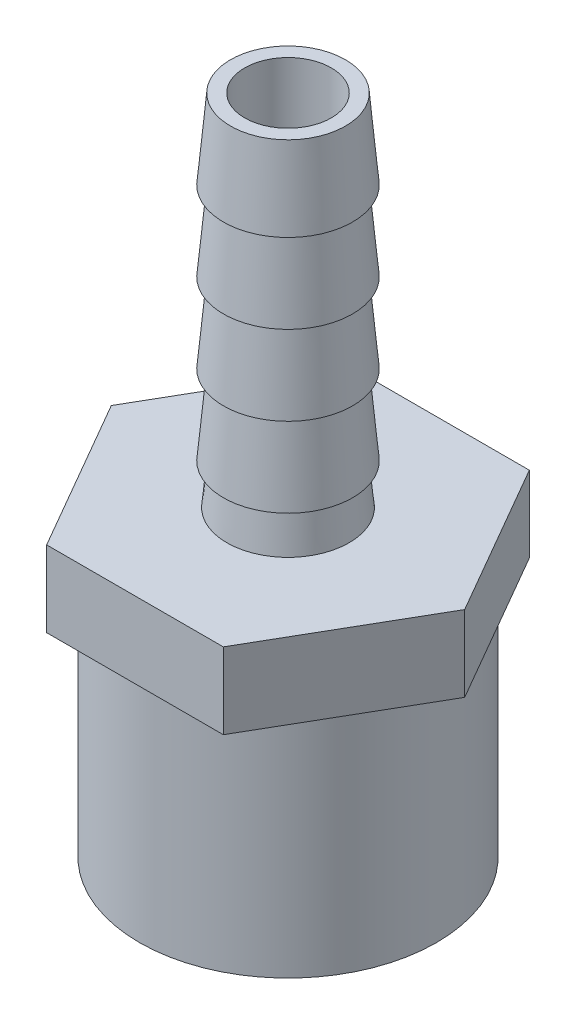
ISO-10303-21;
HEADER;
FILE_DESCRIPTION(('STEP AP214'),'2;1');
FILE_NAME('part.step','',(''),(''),'','','');
FILE_SCHEMA(('AUTOMOTIVE_DESIGN { 1 0 10303 214 1 1 1 1 }'));
ENDSEC;
DATA;
#1=APPLICATION_CONTEXT('core data for automotive mechanical design processes');
#2=APPLICATION_PROTOCOL_DEFINITION('international standard','automotive_design',2000,#1);
#3=PRODUCT_CONTEXT('',#1,'mechanical');
#4=PRODUCT('Part','Part','',(#3));
#5=PRODUCT_RELATED_PRODUCT_CATEGORY('part','',(#4));
#6=PRODUCT_DEFINITION_FORMATION('','',#4);
#7=PRODUCT_DEFINITION_CONTEXT('part definition',#1,'design');
#8=PRODUCT_DEFINITION('design','',#6,#7);
#9=PRODUCT_DEFINITION_SHAPE('','',#8);
#10=(LENGTH_UNIT() NAMED_UNIT(*) SI_UNIT(.MILLI.,.METRE.));
#11=(NAMED_UNIT(*) PLANE_ANGLE_UNIT() SI_UNIT($,.RADIAN.));
#12=(NAMED_UNIT(*) SI_UNIT($,.STERADIAN.) SOLID_ANGLE_UNIT());
#13=UNCERTAINTY_MEASURE_WITH_UNIT(LENGTH_MEASURE(1.E-05),#10,'distance_accuracy_value','');
#14=(GEOMETRIC_REPRESENTATION_CONTEXT(3) GLOBAL_UNCERTAINTY_ASSIGNED_CONTEXT((#13)) GLOBAL_UNIT_ASSIGNED_CONTEXT((#10,
#11,#12)) REPRESENTATION_CONTEXT('',''));
#15=CARTESIAN_POINT('',(0.,0.,0.));
#16=DIRECTION('',(0.,0.,1.));
#17=DIRECTION('',(1.,0.,0.));
#18=AXIS2_PLACEMENT_3D('',#15,#16,#17);
#19=CARTESIAN_POINT('',(0.,-4.3,0.));
#20=DIRECTION('',(0.,1.,0.));
#21=DIRECTION('',(0.,0.,1.));
#22=AXIS2_PLACEMENT_3D('',#19,#20,#21);
#23=PLANE('',#22);
#24=CARTESIAN_POINT('',(0.,-4.3,0.));
#25=DIRECTION('',(0.,1.,0.));
#26=DIRECTION('',(0.,0.,1.));
#27=AXIS2_PLACEMENT_3D('',#24,#25,#26);
#28=CIRCLE('',#27,2.45);
#29=CARTESIAN_POINT('',(0.,-4.3,2.45));
#30=VERTEX_POINT('',#29);
#31=EDGE_CURVE('E127',#30,#30,#28,.T.);
#32=ORIENTED_EDGE('',*,*,#31,.T.);
#33=EDGE_LOOP('',(#32));
#34=FACE_BOUND('',#33,.T.);
#35=CARTESIAN_POINT('',(0.,-4.3,0.));
#36=DIRECTION('',(0.,-1.,0.));
#37=DIRECTION('',(0.,0.,-1.));
#38=AXIS2_PLACEMENT_3D('',#35,#36,#37);
#39=CIRCLE('',#38,5.55);
#40=CARTESIAN_POINT('',(0.,-4.3,-5.55));
#41=VERTEX_POINT('',#40);
#42=EDGE_CURVE('E411',#41,#41,#39,.T.);
#43=ORIENTED_EDGE('',*,*,#42,.T.);
#44=EDGE_LOOP('',(#43));
#45=FACE_BOUND('',#44,.T.);
#46=ADVANCED_FACE('F34',(#34,#45),#23,.F.);
#47=CARTESIAN_POINT('',(4.99407982849027,-4.3,8.65));
#48=DIRECTION('',(0.866025403784439,0.,0.5));
#49=DIRECTION('',(0.5,0.,-0.866025403784439));
#50=AXIS2_PLACEMENT_3D('',#47,#48,#49);
#51=PLANE('',#50);
#52=DIRECTION('',(0.5,0.,-0.866025403784439));
#53=VECTOR('',#52,1.);
#54=CARTESIAN_POINT('',(4.99407982849027,0.,8.65));
#55=LINE('',#54,#53);
#56=CARTESIAN_POINT('',(4.99407982849027,0.,8.65));
#57=VERTEX_POINT('',#56);
#58=CARTESIAN_POINT('',(9.98815965698053,0.,0.));
#59=VERTEX_POINT('',#58);
#60=EDGE_CURVE('E123',#57,#59,#55,.T.);
#61=ORIENTED_EDGE('',*,*,#60,.F.);
#62=DIRECTION('',(0.,1.,0.));
#63=VECTOR('',#62,1.);
#64=CARTESIAN_POINT('',(4.99407982849027,-4.3,8.65));
#65=LINE('',#64,#63);
#66=CARTESIAN_POINT('',(4.99407982849027,-4.3,8.65));
#67=VERTEX_POINT('',#66);
#68=EDGE_CURVE('E52',#67,#57,#65,.T.);
#69=ORIENTED_EDGE('',*,*,#68,.F.);
#70=DIRECTION('',(0.5,0.,-0.866025403784439));
#71=VECTOR('',#70,1.);
#72=CARTESIAN_POINT('',(4.99407982849027,-4.3,8.65));
#73=LINE('',#72,#71);
#74=CARTESIAN_POINT('',(9.98815965698053,-4.3,0.));
#75=VERTEX_POINT('',#74);
#76=EDGE_CURVE('E139',#67,#75,#73,.T.);
#77=ORIENTED_EDGE('',*,*,#76,.T.);
#78=DIRECTION('',(0.,1.,0.));
#79=VECTOR('',#78,1.);
#80=CARTESIAN_POINT('',(9.98815965698053,-4.3,0.));
#81=LINE('',#80,#79);
#82=EDGE_CURVE('E87',#75,#59,#81,.T.);
#83=ORIENTED_EDGE('',*,*,#82,.T.);
#84=EDGE_LOOP('',(#61,#69,#77,#83));
#85=FACE_BOUND('',#84,.T.);
#86=ADVANCED_FACE('F36',(#85),#51,.T.);
#87=CARTESIAN_POINT('',(-4.99407982849026,-4.3,8.65));
#88=DIRECTION('',(0.,0.,1.));
#89=DIRECTION('',(1.,0.,0.));
#90=AXIS2_PLACEMENT_3D('',#87,#88,#89);
#91=PLANE('',#90);
#92=DIRECTION('',(1.,0.,0.));
#93=VECTOR('',#92,1.);
#94=CARTESIAN_POINT('',(-4.99407982849026,0.,8.65));
#95=LINE('',#94,#93);
#96=CARTESIAN_POINT('',(-4.99407982849026,0.,8.65));
#97=VERTEX_POINT('',#96);
#98=EDGE_CURVE('E136',#97,#57,#95,.T.);
#99=ORIENTED_EDGE('',*,*,#98,.F.);
#100=DIRECTION('',(0.,1.,0.));
#101=VECTOR('',#100,1.);
#102=CARTESIAN_POINT('',(-4.99407982849026,-4.3,8.65));
#103=LINE('',#102,#101);
#104=CARTESIAN_POINT('',(-4.99407982849026,-4.3,8.65));
#105=VERTEX_POINT('',#104);
#106=EDGE_CURVE('E75',#105,#97,#103,.T.);
#107=ORIENTED_EDGE('',*,*,#106,.F.);
#108=DIRECTION('',(1.,0.,0.));
#109=VECTOR('',#108,1.);
#110=CARTESIAN_POINT('',(-4.99407982849026,-4.3,8.65));
#111=LINE('',#110,#109);
#112=EDGE_CURVE('E113',#105,#67,#111,.T.);
#113=ORIENTED_EDGE('',*,*,#112,.T.);
#114=ORIENTED_EDGE('',*,*,#68,.T.);
#115=EDGE_LOOP('',(#99,#107,#113,#114));
#116=FACE_BOUND('',#115,.T.);
#117=ADVANCED_FACE('F148',(#116),#91,.T.);
#118=CARTESIAN_POINT('',(-9.98815965698052,-4.3,0.));
#119=DIRECTION('',(-0.866025403784438,0.,0.5));
#120=DIRECTION('',(0.5,0.,0.866025403784439));
#121=AXIS2_PLACEMENT_3D('',#118,#119,#120);
#122=PLANE('',#121);
#123=DIRECTION('',(0.5,0.,0.866025403784438));
#124=VECTOR('',#123,1.);
#125=CARTESIAN_POINT('',(-9.98815965698052,0.,0.));
#126=LINE('',#125,#124);
#127=CARTESIAN_POINT('',(-9.98815965698052,0.,0.));
#128=VERTEX_POINT('',#127);
#129=EDGE_CURVE('E100',#128,#97,#126,.T.);
#130=ORIENTED_EDGE('',*,*,#129,.F.);
#131=DIRECTION('',(0.,1.,0.));
#132=VECTOR('',#131,1.);
#133=CARTESIAN_POINT('',(-9.98815965698052,-4.3,0.));
#134=LINE('',#133,#132);
#135=CARTESIAN_POINT('',(-9.98815965698052,-4.3,0.));
#136=VERTEX_POINT('',#135);
#137=EDGE_CURVE('E95',#136,#128,#134,.T.);
#138=ORIENTED_EDGE('',*,*,#137,.F.);
#139=DIRECTION('',(0.5,0.,0.866025403784438));
#140=VECTOR('',#139,1.);
#141=CARTESIAN_POINT('',(-9.98815965698052,-4.3,0.));
#142=LINE('',#141,#140);
#143=EDGE_CURVE('E98',#136,#105,#142,.T.);
#144=ORIENTED_EDGE('',*,*,#143,.T.);
#145=ORIENTED_EDGE('',*,*,#106,.T.);
#146=EDGE_LOOP('',(#130,#138,#144,#145));
#147=FACE_BOUND('',#146,.T.);
#148=ADVANCED_FACE('F97',(#147),#122,.T.);
#149=CARTESIAN_POINT('',(-4.99407982849026,-4.3,-8.65));
#150=DIRECTION('',(-0.866025403784438,0.,-0.5));
#151=DIRECTION('',(-0.5,0.,0.866025403784439));
#152=AXIS2_PLACEMENT_3D('',#149,#150,#151);
#153=PLANE('',#152);
#154=DIRECTION('',(-0.5,0.,0.866025403784439));
#155=VECTOR('',#154,1.);
#156=CARTESIAN_POINT('',(-4.99407982849026,0.,-8.65));
#157=LINE('',#156,#155);
#158=CARTESIAN_POINT('',(-4.99407982849026,0.,-8.65));
#159=VERTEX_POINT('',#158);
#160=EDGE_CURVE('E133',#159,#128,#157,.T.);
#161=ORIENTED_EDGE('',*,*,#160,.F.);
#162=DIRECTION('',(0.,1.,0.));
#163=VECTOR('',#162,1.);
#164=CARTESIAN_POINT('',(-4.99407982849026,-4.3,-8.65));
#165=LINE('',#164,#163);
#166=CARTESIAN_POINT('',(-4.99407982849026,-4.3,-8.65));
#167=VERTEX_POINT('',#166);
#168=EDGE_CURVE('E105',#167,#159,#165,.T.);
#169=ORIENTED_EDGE('',*,*,#168,.F.);
#170=DIRECTION('',(-0.5,0.,0.866025403784439));
#171=VECTOR('',#170,1.);
#172=CARTESIAN_POINT('',(-4.99407982849026,-4.3,-8.65));
#173=LINE('',#172,#171);
#174=EDGE_CURVE('E111',#167,#136,#173,.T.);
#175=ORIENTED_EDGE('',*,*,#174,.T.);
#176=ORIENTED_EDGE('',*,*,#137,.T.);
#177=EDGE_LOOP('',(#161,#169,#175,#176));
#178=FACE_BOUND('',#177,.T.);
#179=ADVANCED_FACE('F115',(#178),#153,.T.);
#180=CARTESIAN_POINT('',(4.99407982849026,-4.3,-8.65));
#181=DIRECTION('',(0.,0.,-1.));
#182=DIRECTION('',(-1.,0.,0.));
#183=AXIS2_PLACEMENT_3D('',#180,#181,#182);
#184=PLANE('',#183);
#185=DIRECTION('',(-1.,0.,0.));
#186=VECTOR('',#185,1.);
#187=CARTESIAN_POINT('',(4.99407982849026,0.,-8.65));
#188=LINE('',#187,#186);
#189=CARTESIAN_POINT('',(4.99407982849026,0.,-8.65));
#190=VERTEX_POINT('',#189);
#191=EDGE_CURVE('E130',#190,#159,#188,.T.);
#192=ORIENTED_EDGE('',*,*,#191,.F.);
#193=DIRECTION('',(0.,1.,0.));
#194=VECTOR('',#193,1.);
#195=CARTESIAN_POINT('',(4.99407982849026,-4.3,-8.65));
#196=LINE('',#195,#194);
#197=CARTESIAN_POINT('',(4.99407982849026,-4.3,-8.65));
#198=VERTEX_POINT('',#197);
#199=EDGE_CURVE('E143',#198,#190,#196,.T.);
#200=ORIENTED_EDGE('',*,*,#199,.F.);
#201=DIRECTION('',(-1.,0.,0.));
#202=VECTOR('',#201,1.);
#203=CARTESIAN_POINT('',(4.99407982849026,-4.3,-8.65));
#204=LINE('',#203,#202);
#205=EDGE_CURVE('E116',#198,#167,#204,.T.);
#206=ORIENTED_EDGE('',*,*,#205,.T.);
#207=ORIENTED_EDGE('',*,*,#168,.T.);
#208=EDGE_LOOP('',(#192,#200,#206,#207));
#209=FACE_BOUND('',#208,.T.);
#210=ADVANCED_FACE('F173',(#209),#184,.T.);
#211=CARTESIAN_POINT('',(9.98815965698053,-4.3,0.));
#212=DIRECTION('',(0.866025403784438,0.,-0.5));
#213=DIRECTION('',(-0.5,0.,-0.866025403784439));
#214=AXIS2_PLACEMENT_3D('',#211,#212,#213);
#215=PLANE('',#214);
#216=DIRECTION('',(-0.5,0.,-0.866025403784438));
#217=VECTOR('',#216,1.);
#218=CARTESIAN_POINT('',(9.98815965698053,0.,0.));
#219=LINE('',#218,#217);
#220=EDGE_CURVE('E126',#59,#190,#219,.T.);
#221=ORIENTED_EDGE('',*,*,#220,.F.);
#222=ORIENTED_EDGE('',*,*,#82,.F.);
#223=DIRECTION('',(-0.5,0.,-0.866025403784438));
#224=VECTOR('',#223,1.);
#225=CARTESIAN_POINT('',(9.98815965698053,-4.3,0.));
#226=LINE('',#225,#224);
#227=EDGE_CURVE('E118',#75,#198,#226,.T.);
#228=ORIENTED_EDGE('',*,*,#227,.T.);
#229=ORIENTED_EDGE('',*,*,#199,.T.);
#230=EDGE_LOOP('',(#221,#222,#228,#229));
#231=FACE_BOUND('',#230,.T.);
#232=ADVANCED_FACE('F144',(#231),#215,.T.);
#233=CARTESIAN_POINT('',(0.,-4.3,0.));
#234=DIRECTION('',(0.,-1.,0.));
#235=DIRECTION('',(0.,0.,-1.));
#236=AXIS2_PLACEMENT_3D('',#233,#234,#235);
#237=CIRCLE('',#236,8.4);
#238=CARTESIAN_POINT('',(0.,-4.3,-8.4));
#239=VERTEX_POINT('',#238);
#240=EDGE_CURVE('E11',#239,#239,#237,.T.);
#241=ORIENTED_EDGE('',*,*,#240,.F.);
#242=EDGE_LOOP('',(#241));
#243=FACE_BOUND('',#242,.T.);
#244=ORIENTED_EDGE('',*,*,#76,.F.);
#245=ORIENTED_EDGE('',*,*,#112,.F.);
#246=ORIENTED_EDGE('',*,*,#143,.F.);
#247=ORIENTED_EDGE('',*,*,#174,.F.);
#248=ORIENTED_EDGE('',*,*,#205,.F.);
#249=ORIENTED_EDGE('',*,*,#227,.F.);
#250=EDGE_LOOP('',(#244,#245,#246,#247,#248,#249));
#251=FACE_BOUND('',#250,.T.);
#252=ADVANCED_FACE('F109',(#243,#251),#23,.F.);
#253=CARTESIAN_POINT('',(0.,0.,0.));
#254=DIRECTION('',(0.,1.,0.));
#255=DIRECTION('',(0.,0.,1.));
#256=AXIS2_PLACEMENT_3D('',#253,#254,#255);
#257=PLANE('',#256);
#258=CARTESIAN_POINT('',(0.,0.,0.));
#259=DIRECTION('',(0.,1.,0.));
#260=DIRECTION('',(0.,0.,1.));
#261=AXIS2_PLACEMENT_3D('',#258,#259,#260);
#262=CIRCLE('',#261,3.45444444444444);
#263=CARTESIAN_POINT('',(0.,0.,3.45444444444444));
#264=VERTEX_POINT('',#263);
#265=EDGE_CURVE('E38',#264,#264,#262,.T.);
#266=ORIENTED_EDGE('',*,*,#265,.F.);
#267=EDGE_LOOP('',(#266));
#268=FACE_BOUND('',#267,.T.);
#269=ORIENTED_EDGE('',*,*,#60,.T.);
#270=ORIENTED_EDGE('',*,*,#220,.T.);
#271=ORIENTED_EDGE('',*,*,#191,.T.);
#272=ORIENTED_EDGE('',*,*,#160,.T.);
#273=ORIENTED_EDGE('',*,*,#129,.T.);
#274=ORIENTED_EDGE('',*,*,#98,.T.);
#275=EDGE_LOOP('',(#269,#270,#271,#272,#273,#274));
#276=FACE_BOUND('',#275,.T.);
#277=ADVANCED_FACE('F147',(#268,#276),#257,.T.);
#278=CARTESIAN_POINT('',(0.,-4.3,0.));
#279=DIRECTION('',(0.,1.,0.));
#280=DIRECTION('',(0.,0.,1.));
#281=AXIS2_PLACEMENT_3D('',#278,#279,#280);
#282=CYLINDRICAL_SURFACE('',#281,2.45);
#283=CARTESIAN_POINT('',(0.,20.3,0.));
#284=DIRECTION('',(0.,-1.,0.));
#285=DIRECTION('',(0.,0.,-1.));
#286=AXIS2_PLACEMENT_3D('',#283,#284,#285);
#287=CIRCLE('',#286,2.45);
#288=CARTESIAN_POINT('',(0.,20.3,2.45));
#289=VERTEX_POINT('',#288);
#290=EDGE_CURVE('E239',#289,#289,#287,.T.);
#291=CARTESIAN_POINT('',(0.,-4.3,2.45));
#292=CARTESIAN_POINT('',(0.,-4.04375,2.45));
#293=CARTESIAN_POINT('',(0.,-3.7875,2.45));
#294=CARTESIAN_POINT('',(0.,-3.275,2.45));
#295=CARTESIAN_POINT('',(0.,-3.01875,2.45));
#296=CARTESIAN_POINT('',(0.,-2.50625,2.45));
#297=CARTESIAN_POINT('',(0.,-2.25,2.45));
#298=CARTESIAN_POINT('',(0.,-1.7375,2.45));
#299=CARTESIAN_POINT('',(0.,-1.48125,2.45));
#300=CARTESIAN_POINT('',(0.,-0.968749999999999,2.45));
#301=CARTESIAN_POINT('',(0.,-0.712499999999999,2.45));
#302=CARTESIAN_POINT('',(0.,-0.199999999999999,2.45));
#303=CARTESIAN_POINT('',(0.,0.056250000000001,2.45));
#304=CARTESIAN_POINT('',(0.,0.568750000000001,2.45));
#305=CARTESIAN_POINT('',(0.,0.825000000000001,2.45));
#306=CARTESIAN_POINT('',(0.,1.3375,2.45));
#307=CARTESIAN_POINT('',(0.,1.59375,2.45));
#308=CARTESIAN_POINT('',(0.,2.10625,2.45));
#309=CARTESIAN_POINT('',(0.,2.3625,2.45));
#310=CARTESIAN_POINT('',(0.,2.875,2.45));
#311=CARTESIAN_POINT('',(0.,3.13125,2.45));
#312=CARTESIAN_POINT('',(0.,3.64375,2.45));
#313=CARTESIAN_POINT('',(0.,3.9,2.45));
#314=CARTESIAN_POINT('',(0.,4.4125,2.45));
#315=CARTESIAN_POINT('',(0.,4.66875,2.45));
#316=CARTESIAN_POINT('',(0.,5.18125,2.45));
#317=CARTESIAN_POINT('',(0.,5.4375,2.45));
#318=CARTESIAN_POINT('',(0.,5.95,2.45));
#319=CARTESIAN_POINT('',(0.,6.20625,2.45));
#320=CARTESIAN_POINT('',(0.,6.71875,2.45));
#321=CARTESIAN_POINT('',(0.,6.975,2.45));
#322=CARTESIAN_POINT('',(0.,7.4875,2.45));
#323=CARTESIAN_POINT('',(0.,7.74375,2.45));
#324=CARTESIAN_POINT('',(0.,8.25625,2.45));
#325=CARTESIAN_POINT('',(0.,8.5125,2.45));
#326=CARTESIAN_POINT('',(0.,9.025,2.45));
#327=CARTESIAN_POINT('',(0.,9.28125000000001,2.45));
#328=CARTESIAN_POINT('',(0.,9.79375,2.45));
#329=CARTESIAN_POINT('',(0.,10.05,2.45));
#330=CARTESIAN_POINT('',(0.,10.5625,2.45));
#331=CARTESIAN_POINT('',(0.,10.81875,2.45));
#332=CARTESIAN_POINT('',(0.,11.33125,2.45));
#333=CARTESIAN_POINT('',(0.,11.5875,2.45));
#334=CARTESIAN_POINT('',(0.,12.1,2.45));
#335=CARTESIAN_POINT('',(0.,12.35625,2.45));
#336=CARTESIAN_POINT('',(0.,12.86875,2.45));
#337=CARTESIAN_POINT('',(0.,13.125,2.45));
#338=CARTESIAN_POINT('',(0.,13.6375,2.45));
#339=CARTESIAN_POINT('',(0.,13.89375,2.45));
#340=CARTESIAN_POINT('',(0.,14.40625,2.45));
#341=CARTESIAN_POINT('',(0.,14.6625,2.45));
#342=CARTESIAN_POINT('',(0.,15.175,2.45));
#343=CARTESIAN_POINT('',(0.,15.43125,2.45));
#344=CARTESIAN_POINT('',(0.,15.94375,2.45));
#345=CARTESIAN_POINT('',(0.,16.2,2.45));
#346=CARTESIAN_POINT('',(0.,16.7125,2.45));
#347=CARTESIAN_POINT('',(0.,16.96875,2.45));
#348=CARTESIAN_POINT('',(0.,17.48125,2.45));
#349=CARTESIAN_POINT('',(0.,17.7375,2.45));
#350=CARTESIAN_POINT('',(0.,18.25,2.45));
#351=CARTESIAN_POINT('',(0.,18.50625,2.45));
#352=CARTESIAN_POINT('',(0.,19.01875,2.45));
#353=CARTESIAN_POINT('',(0.,19.275,2.45));
#354=CARTESIAN_POINT('',(0.,19.7875,2.45));
#355=CARTESIAN_POINT('',(0.,20.04375,2.45));
#356=CARTESIAN_POINT('',(0.,20.3,2.45));
#357=B_SPLINE_CURVE_WITH_KNOTS('',3,(#291,#292,#293,#294,#295,#296,#297,#298,#299,#300,#301,
#302,#303,#304,#305,#306,#307,#308,#309,#310,#311,#312,#313,#314,#315,#316,#317,#318,#319,#320,
#321,#322,#323,#324,#325,#326,#327,#328,#329,#330,#331,#332,#333,#334,#335,#336,#337,#338,#339,
#340,#341,#342,#343,#344,#345,#346,#347,#348,#349,#350,#351,#352,#353,#354,#355,#356),
.UNSPECIFIED.,.F.,.F.,(4,2,2,2,2,2,2,2,2,2,2,2,2,2,2,2,2,2,2,2,2,2,2,2,2,2,2,2,2,2,2,2,4),(0.,
0.76875,1.5375,2.30625,3.075,3.84375,4.6125,5.38125,6.15,6.91875,7.6875,8.45625,9.225,9.99375,
10.7625,11.53125,12.3,13.06875,13.8375,14.60625,15.375,16.14375,16.9125,17.68125,18.45,19.21875,
19.9875,20.75625,21.525,22.29375,23.0625,23.83125,24.6),.UNSPECIFIED.);
#358=EDGE_CURVE('BSEAM171',#30,#289,#357,.T.);
#359=ORIENTED_EDGE('',*,*,#31,.F.);
#360=ORIENTED_EDGE('',*,*,#290,.F.);
#361=ORIENTED_EDGE('',*,*,#358,.T.);
#362=ORIENTED_EDGE('',*,*,#358,.F.);
#363=EDGE_LOOP('',(#359,#361,#360,#362));
#364=FACE_BOUND('',#363,.T.);
#365=ADVANCED_FACE('F171',(#364),#282,.F.);
#366=CARTESIAN_POINT('',(2.45,20.3,0.));
#367=DIRECTION('',(0.,1.,0.));
#368=DIRECTION('',(0.,0.,1.));
#369=AXIS2_PLACEMENT_3D('',#366,#367,#368);
#370=PLANE('',#369);
#371=ORIENTED_EDGE('',*,*,#290,.T.);
#372=EDGE_LOOP('',(#371));
#373=FACE_BOUND('',#372,.T.);
#374=CARTESIAN_POINT('',(0.,20.3,0.));
#375=DIRECTION('',(0.,-1.,0.));
#376=DIRECTION('',(0.,0.,-1.));
#377=AXIS2_PLACEMENT_3D('',#374,#375,#376);
#378=CIRCLE('',#377,3.25);
#379=CARTESIAN_POINT('',(0.,20.3,-3.25));
#380=VERTEX_POINT('',#379);
#381=EDGE_CURVE('E240',#380,#380,#378,.T.);
#382=ORIENTED_EDGE('',*,*,#381,.F.);
#383=EDGE_LOOP('',(#382));
#384=FACE_BOUND('',#383,.T.);
#385=ADVANCED_FACE('F227',(#373,#384),#370,.T.);
#386=CARTESIAN_POINT('',(0.,15.8,0.));
#387=DIRECTION('',(0.,-1.,0.));
#388=DIRECTION('',(0.,0.,-1.));
#389=AXIS2_PLACEMENT_3D('',#386,#387,#388);
#390=CONICAL_SURFACE('',#389,3.65,0.0886558818674376);
#391=ORIENTED_EDGE('',*,*,#381,.T.);
#392=EDGE_LOOP('',(#391));
#393=FACE_BOUND('',#392,.T.);
#394=CARTESIAN_POINT('',(0.,15.8,0.));
#395=DIRECTION('',(0.,-1.,0.));
#396=DIRECTION('',(0.,0.,-1.));
#397=AXIS2_PLACEMENT_3D('',#394,#395,#396);
#398=CIRCLE('',#397,3.65);
#399=CARTESIAN_POINT('',(0.,15.8,-3.65));
#400=VERTEX_POINT('',#399);
#401=EDGE_CURVE('E244',#400,#400,#398,.T.);
#402=ORIENTED_EDGE('',*,*,#401,.F.);
#403=EDGE_LOOP('',(#402));
#404=FACE_BOUND('',#403,.T.);
#405=ADVANCED_FACE('F223',(#393,#404),#390,.T.);
#406=CARTESIAN_POINT('',(3.65,15.8,0.));
#407=DIRECTION('',(0.,-1.,0.));
#408=DIRECTION('',(0.,0.,-1.));
#409=AXIS2_PLACEMENT_3D('',#406,#407,#408);
#410=PLANE('',#409);
#411=ORIENTED_EDGE('',*,*,#401,.T.);
#412=EDGE_LOOP('',(#411));
#413=FACE_BOUND('',#412,.T.);
#414=CARTESIAN_POINT('',(0.,15.8,0.));
#415=DIRECTION('',(0.,-1.,0.));
#416=DIRECTION('',(0.,0.,-1.));
#417=AXIS2_PLACEMENT_3D('',#414,#415,#416);
#418=CIRCLE('',#417,3.25);
#419=CARTESIAN_POINT('',(0.,15.8,-3.25));
#420=VERTEX_POINT('',#419);
#421=EDGE_CURVE('E386',#420,#420,#418,.T.);
#422=ORIENTED_EDGE('',*,*,#421,.F.);
#423=EDGE_LOOP('',(#422));
#424=FACE_BOUND('',#423,.T.);
#425=ADVANCED_FACE('F219',(#413,#424),#410,.T.);
#426=CARTESIAN_POINT('',(0.,11.3,0.));
#427=DIRECTION('',(0.,-1.,0.));
#428=DIRECTION('',(0.,0.,-1.));
#429=AXIS2_PLACEMENT_3D('',#426,#427,#428);
#430=CONICAL_SURFACE('',#429,3.65,0.0886558818674374);
#431=ORIENTED_EDGE('',*,*,#421,.T.);
#432=EDGE_LOOP('',(#431));
#433=FACE_BOUND('',#432,.T.);
#434=CARTESIAN_POINT('',(0.,11.3,0.));
#435=DIRECTION('',(0.,-1.,0.));
#436=DIRECTION('',(0.,0.,-1.));
#437=AXIS2_PLACEMENT_3D('',#434,#435,#436);
#438=CIRCLE('',#437,3.65);
#439=CARTESIAN_POINT('',(0.,11.3,-3.65));
#440=VERTEX_POINT('',#439);
#441=EDGE_CURVE('E389',#440,#440,#438,.T.);
#442=ORIENTED_EDGE('',*,*,#441,.F.);
#443=EDGE_LOOP('',(#442));
#444=FACE_BOUND('',#443,.T.);
#445=ADVANCED_FACE('F215',(#433,#444),#430,.T.);
#446=CARTESIAN_POINT('',(3.65,11.3,0.));
#447=DIRECTION('',(0.,-1.,0.));
#448=DIRECTION('',(0.,0.,-1.));
#449=AXIS2_PLACEMENT_3D('',#446,#447,#448);
#450=PLANE('',#449);
#451=ORIENTED_EDGE('',*,*,#441,.T.);
#452=EDGE_LOOP('',(#451));
#453=FACE_BOUND('',#452,.T.);
#454=CARTESIAN_POINT('',(0.,11.3,0.));
#455=DIRECTION('',(0.,-1.,0.));
#456=DIRECTION('',(0.,0.,-1.));
#457=AXIS2_PLACEMENT_3D('',#454,#455,#456);
#458=CIRCLE('',#457,3.25);
#459=CARTESIAN_POINT('',(0.,11.3,-3.25));
#460=VERTEX_POINT('',#459);
#461=EDGE_CURVE('E392',#460,#460,#458,.T.);
#462=ORIENTED_EDGE('',*,*,#461,.F.);
#463=EDGE_LOOP('',(#462));
#464=FACE_BOUND('',#463,.T.);
#465=ADVANCED_FACE('F211',(#453,#464),#450,.T.);
#466=CARTESIAN_POINT('',(0.,6.80000000000001,0.));
#467=DIRECTION('',(0.,-1.,0.));
#468=DIRECTION('',(0.,0.,-1.));
#469=AXIS2_PLACEMENT_3D('',#466,#467,#468);
#470=CONICAL_SURFACE('',#469,3.65,0.0886558818674375);
#471=ORIENTED_EDGE('',*,*,#461,.T.);
#472=EDGE_LOOP('',(#471));
#473=FACE_BOUND('',#472,.T.);
#474=CARTESIAN_POINT('',(0.,6.80000000000001,0.));
#475=DIRECTION('',(0.,-1.,0.));
#476=DIRECTION('',(0.,0.,-1.));
#477=AXIS2_PLACEMENT_3D('',#474,#475,#476);
#478=CIRCLE('',#477,3.65);
#479=CARTESIAN_POINT('',(0.,6.80000000000001,-3.65));
#480=VERTEX_POINT('',#479);
#481=EDGE_CURVE('E395',#480,#480,#478,.T.);
#482=ORIENTED_EDGE('',*,*,#481,.F.);
#483=EDGE_LOOP('',(#482));
#484=FACE_BOUND('',#483,.T.);
#485=ADVANCED_FACE('F207',(#473,#484),#470,.T.);
#486=CARTESIAN_POINT('',(3.65,6.80000000000001,0.));
#487=DIRECTION('',(0.,-1.,0.));
#488=DIRECTION('',(0.,0.,-1.));
#489=AXIS2_PLACEMENT_3D('',#486,#487,#488);
#490=PLANE('',#489);
#491=ORIENTED_EDGE('',*,*,#481,.T.);
#492=EDGE_LOOP('',(#491));
#493=FACE_BOUND('',#492,.T.);
#494=CARTESIAN_POINT('',(0.,6.80000000000001,0.));
#495=DIRECTION('',(0.,-1.,0.));
#496=DIRECTION('',(0.,0.,-1.));
#497=AXIS2_PLACEMENT_3D('',#494,#495,#496);
#498=CIRCLE('',#497,3.25);
#499=CARTESIAN_POINT('',(0.,6.80000000000001,-3.25));
#500=VERTEX_POINT('',#499);
#501=EDGE_CURVE('E398',#500,#500,#498,.T.);
#502=ORIENTED_EDGE('',*,*,#501,.F.);
#503=EDGE_LOOP('',(#502));
#504=FACE_BOUND('',#503,.T.);
#505=ADVANCED_FACE('F203',(#493,#504),#490,.T.);
#506=CARTESIAN_POINT('',(0.,2.30000000000001,0.));
#507=DIRECTION('',(0.,-1.,0.));
#508=DIRECTION('',(0.,0.,-1.));
#509=AXIS2_PLACEMENT_3D('',#506,#507,#508);
#510=CONICAL_SURFACE('',#509,3.65,0.0886558818674375);
#511=ORIENTED_EDGE('',*,*,#501,.T.);
#512=EDGE_LOOP('',(#511));
#513=FACE_BOUND('',#512,.T.);
#514=CARTESIAN_POINT('',(0.,2.30000000000001,0.));
#515=DIRECTION('',(0.,-1.,0.));
#516=DIRECTION('',(0.,0.,-1.));
#517=AXIS2_PLACEMENT_3D('',#514,#515,#516);
#518=CIRCLE('',#517,3.65);
#519=CARTESIAN_POINT('',(0.,2.30000000000001,-3.65));
#520=VERTEX_POINT('',#519);
#521=EDGE_CURVE('E401',#520,#520,#518,.T.);
#522=ORIENTED_EDGE('',*,*,#521,.F.);
#523=EDGE_LOOP('',(#522));
#524=FACE_BOUND('',#523,.T.);
#525=ADVANCED_FACE('F199',(#513,#524),#510,.T.);
#526=CARTESIAN_POINT('',(3.65,2.30000000000001,0.));
#527=DIRECTION('',(0.,-1.,0.));
#528=DIRECTION('',(0.,0.,-1.));
#529=AXIS2_PLACEMENT_3D('',#526,#527,#528);
#530=PLANE('',#529);
#531=ORIENTED_EDGE('',*,*,#521,.T.);
#532=EDGE_LOOP('',(#531));
#533=FACE_BOUND('',#532,.T.);
#534=CARTESIAN_POINT('',(0.,2.30000000000001,0.));
#535=DIRECTION('',(0.,-1.,0.));
#536=DIRECTION('',(0.,0.,-1.));
#537=AXIS2_PLACEMENT_3D('',#534,#535,#536);
#538=CIRCLE('',#537,3.25);
#539=CARTESIAN_POINT('',(0.,2.30000000000001,-3.25));
#540=VERTEX_POINT('',#539);
#541=EDGE_CURVE('E404',#540,#540,#538,.T.);
#542=ORIENTED_EDGE('',*,*,#541,.F.);
#543=EDGE_LOOP('',(#542));
#544=FACE_BOUND('',#543,.T.);
#545=ADVANCED_FACE('F195',(#533,#544),#530,.T.);
#546=CARTESIAN_POINT('',(0.,0.,0.));
#547=DIRECTION('',(0.,-1.,0.));
#548=DIRECTION('',(0.,0.,-1.));
#549=AXIS2_PLACEMENT_3D('',#546,#547,#548);
#550=CONICAL_SURFACE('',#549,3.45444444444444,0.0886558818674373);
#551=ORIENTED_EDGE('',*,*,#541,.T.);
#552=EDGE_LOOP('',(#551));
#553=FACE_BOUND('',#552,.T.);
#554=ORIENTED_EDGE('',*,*,#265,.T.);
#555=EDGE_LOOP('',(#554));
#556=FACE_BOUND('',#555,.T.);
#557=ADVANCED_FACE('F188',(#553,#556),#550,.T.);
#558=CARTESIAN_POINT('',(0.,-17.1,0.));
#559=DIRECTION('',(0.,-1.,0.));
#560=DIRECTION('',(0.,0.,-1.));
#561=AXIS2_PLACEMENT_3D('',#558,#559,#560);
#562=PLANE('',#561);
#563=CARTESIAN_POINT('',(0.,-17.1,0.));
#564=DIRECTION('',(0.,-1.,0.));
#565=DIRECTION('',(0.,0.,-1.));
#566=AXIS2_PLACEMENT_3D('',#563,#564,#565);
#567=CIRCLE('',#566,8.4);
#568=CARTESIAN_POINT('',(0.,-17.1,-8.4));
#569=VERTEX_POINT('',#568);
#570=EDGE_CURVE('E406',#569,#569,#567,.T.);
#571=ORIENTED_EDGE('',*,*,#570,.T.);
#572=EDGE_LOOP('',(#571));
#573=FACE_BOUND('',#572,.T.);
#574=CARTESIAN_POINT('',(0.,-17.1,0.));
#575=DIRECTION('',(0.,-1.,0.));
#576=DIRECTION('',(0.,0.,-1.));
#577=AXIS2_PLACEMENT_3D('',#574,#575,#576);
#578=CIRCLE('',#577,5.55);
#579=CARTESIAN_POINT('',(0.,-17.1,-5.55));
#580=VERTEX_POINT('',#579);
#581=EDGE_CURVE('E410',#580,#580,#578,.T.);
#582=ORIENTED_EDGE('',*,*,#581,.F.);
#583=EDGE_LOOP('',(#582));
#584=FACE_BOUND('',#583,.T.);
#585=ADVANCED_FACE('F179',(#573,#584),#562,.T.);
#586=CARTESIAN_POINT('',(0.,-17.1,0.));
#587=DIRECTION('',(0.,1.,0.));
#588=DIRECTION('',(0.,0.,1.));
#589=AXIS2_PLACEMENT_3D('',#586,#587,#588);
#590=CYLINDRICAL_SURFACE('',#589,8.4);
#591=ORIENTED_EDGE('',*,*,#570,.F.);
#592=EDGE_LOOP('',(#591));
#593=FACE_BOUND('',#592,.T.);
#594=ORIENTED_EDGE('',*,*,#240,.T.);
#595=EDGE_LOOP('',(#594));
#596=FACE_BOUND('',#595,.T.);
#597=ADVANCED_FACE('F176',(#593,#596),#590,.T.);
#598=CARTESIAN_POINT('',(0.,-17.1,0.));
#599=DIRECTION('',(0.,1.,0.));
#600=DIRECTION('',(0.,0.,1.));
#601=AXIS2_PLACEMENT_3D('',#598,#599,#600);
#602=CYLINDRICAL_SURFACE('',#601,5.55);
#603=ORIENTED_EDGE('',*,*,#581,.T.);
#604=EDGE_LOOP('',(#603));
#605=FACE_BOUND('',#604,.T.);
#606=ORIENTED_EDGE('',*,*,#42,.F.);
#607=EDGE_LOOP('',(#606));
#608=FACE_BOUND('',#607,.T.);
#609=ADVANCED_FACE('F178',(#605,#608),#602,.F.);
#610=CLOSED_SHELL('',(#46,#86,#117,#148,#179,#210,#232,#252,#277,#365,#385,#405,#425,#445,#465,
#485,#505,#525,#545,#557,#585,#597,#609));
#611=MANIFOLD_SOLID_BREP('B2',#610);
#612=ADVANCED_BREP_SHAPE_REPRESENTATION('',(#18,#611),#14);
#613=SHAPE_DEFINITION_REPRESENTATION(#9,#612);
ENDSEC;
END-ISO-10303-21;
